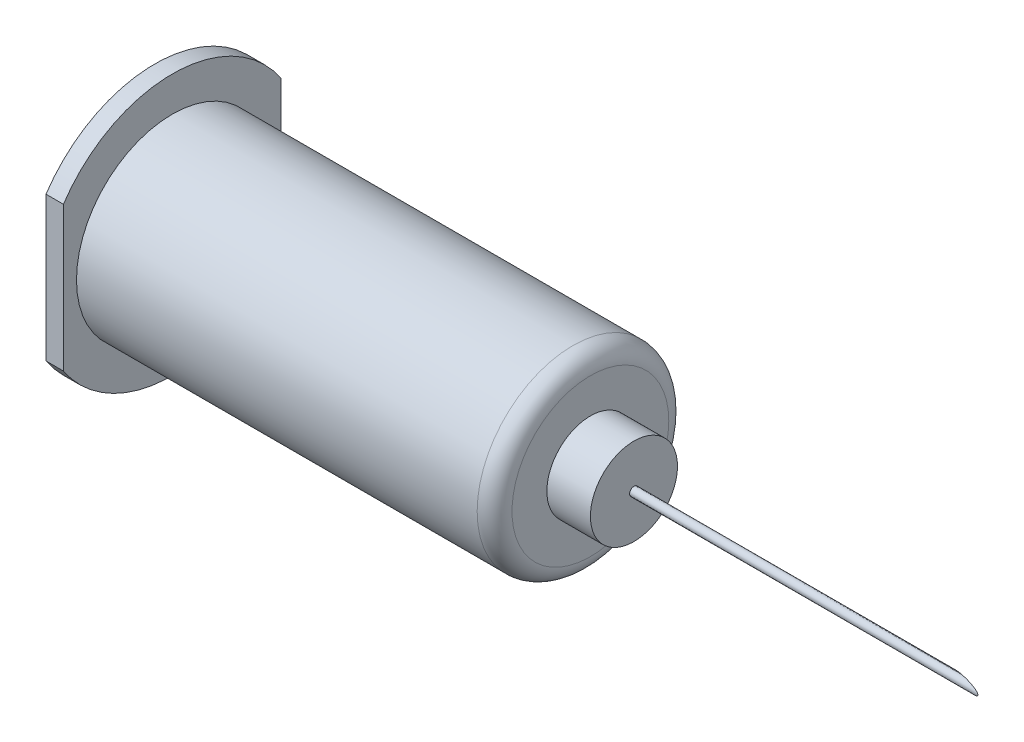
ISO-10303-21;
HEADER;
FILE_DESCRIPTION(('STEP AP214'),'2;1');
FILE_NAME('part.step','',(''),(''),'','','');
FILE_SCHEMA(('AUTOMOTIVE_DESIGN { 1 0 10303 214 1 1 1 1 }'));
ENDSEC;
DATA;
#1=APPLICATION_CONTEXT('core data for automotive mechanical design processes');
#2=APPLICATION_PROTOCOL_DEFINITION('international standard','automotive_design',2000,#1);
#3=PRODUCT_CONTEXT('',#1,'mechanical');
#4=PRODUCT('Part','Part','',(#3));
#5=PRODUCT_RELATED_PRODUCT_CATEGORY('part','',(#4));
#6=PRODUCT_DEFINITION_FORMATION('','',#4);
#7=PRODUCT_DEFINITION_CONTEXT('part definition',#1,'design');
#8=PRODUCT_DEFINITION('design','',#6,#7);
#9=PRODUCT_DEFINITION_SHAPE('','',#8);
#10=(LENGTH_UNIT() NAMED_UNIT(*) SI_UNIT(.MILLI.,.METRE.));
#11=(NAMED_UNIT(*) PLANE_ANGLE_UNIT() SI_UNIT($,.RADIAN.));
#12=(NAMED_UNIT(*) SI_UNIT($,.STERADIAN.) SOLID_ANGLE_UNIT());
#13=UNCERTAINTY_MEASURE_WITH_UNIT(LENGTH_MEASURE(1.E-05),#10,'distance_accuracy_value','');
#14=(GEOMETRIC_REPRESENTATION_CONTEXT(3) GLOBAL_UNCERTAINTY_ASSIGNED_CONTEXT((#13)) GLOBAL_UNIT_ASSIGNED_CONTEXT((#10,
#11,#12)) REPRESENTATION_CONTEXT('',''));
#15=CARTESIAN_POINT('',(0.,0.,0.));
#16=DIRECTION('',(0.,0.,1.));
#17=DIRECTION('',(1.,0.,0.));
#18=AXIS2_PLACEMENT_3D('',#15,#16,#17);
#19=CARTESIAN_POINT('',(2.,0.,0.));
#20=DIRECTION('',(1.,0.,0.));
#21=DIRECTION('',(0.,0.,-1.));
#22=AXIS2_PLACEMENT_3D('',#19,#20,#21);
#23=PLANE('',#22);
#24=CARTESIAN_POINT('',(2.,0.,0.));
#25=DIRECTION('',(1.,0.,0.));
#26=DIRECTION('',(0.,0.,-1.));
#27=AXIS2_PLACEMENT_3D('',#24,#25,#26);
#28=CIRCLE('',#27,15.);
#29=CARTESIAN_POINT('',(2.,-8.2915619758885,12.5));
#30=VERTEX_POINT('',#29);
#31=CARTESIAN_POINT('',(2.,-8.2915619758885,-12.5));
#32=VERTEX_POINT('',#31);
#33=EDGE_CURVE('E112',#30,#32,#28,.T.);
#34=ORIENTED_EDGE('',*,*,#33,.T.);
#35=DIRECTION('',(0.,1.,0.));
#36=VECTOR('',#35,1.);
#37=CARTESIAN_POINT('',(2.,-8.2915619758885,-12.5));
#38=LINE('',#37,#36);
#39=CARTESIAN_POINT('',(2.,8.2915619758885,-12.5));
#40=VERTEX_POINT('',#39);
#41=EDGE_CURVE('E107',#32,#40,#38,.T.);
#42=ORIENTED_EDGE('',*,*,#41,.T.);
#43=CARTESIAN_POINT('',(2.,0.,0.));
#44=DIRECTION('',(1.,0.,0.));
#45=DIRECTION('',(0.,0.,-1.));
#46=AXIS2_PLACEMENT_3D('',#43,#44,#45);
#47=CIRCLE('',#46,15.);
#48=CARTESIAN_POINT('',(2.,8.2915619758885,12.5));
#49=VERTEX_POINT('',#48);
#50=EDGE_CURVE('E110',#40,#49,#47,.T.);
#51=ORIENTED_EDGE('',*,*,#50,.T.);
#52=DIRECTION('',(0.,-1.,0.));
#53=VECTOR('',#52,1.);
#54=CARTESIAN_POINT('',(2.,-8.2915619758885,12.5));
#55=LINE('',#54,#53);
#56=EDGE_CURVE('E77',#49,#30,#55,.T.);
#57=ORIENTED_EDGE('',*,*,#56,.T.);
#58=EDGE_LOOP('',(#34,#42,#51,#57));
#59=FACE_BOUND('',#58,.T.);
#60=CARTESIAN_POINT('',(2.,0.,0.));
#61=DIRECTION('',(1.,0.,0.));
#62=DIRECTION('',(0.,0.,-1.));
#63=AXIS2_PLACEMENT_3D('',#60,#61,#62);
#64=CIRCLE('',#63,10.);
#65=CARTESIAN_POINT('',(2.,0.,-10.));
#66=VERTEX_POINT('',#65);
#67=EDGE_CURVE('E127',#66,#66,#64,.T.);
#68=ORIENTED_EDGE('',*,*,#67,.F.);
#69=EDGE_LOOP('',(#68));
#70=FACE_BOUND('',#69,.T.);
#71=ADVANCED_FACE('F60',(#59,#70),#23,.T.);
#72=CARTESIAN_POINT('',(0.,0.,0.));
#73=DIRECTION('',(1.,0.,0.));
#74=DIRECTION('',(0.,0.,-1.));
#75=AXIS2_PLACEMENT_3D('',#72,#73,#74);
#76=PLANE('',#75);
#77=CARTESIAN_POINT('',(0.,0.,0.));
#78=DIRECTION('',(1.,0.,0.));
#79=DIRECTION('',(0.,0.,-1.));
#80=AXIS2_PLACEMENT_3D('',#77,#78,#79);
#81=CIRCLE('',#80,15.);
#82=CARTESIAN_POINT('',(0.,-8.2915619758885,12.5));
#83=VERTEX_POINT('',#82);
#84=CARTESIAN_POINT('',(0.,-8.2915619758885,-12.5));
#85=VERTEX_POINT('',#84);
#86=EDGE_CURVE('E124',#83,#85,#81,.T.);
#87=ORIENTED_EDGE('',*,*,#86,.F.);
#88=DIRECTION('',(0.,-1.,0.));
#89=VECTOR('',#88,1.);
#90=CARTESIAN_POINT('',(0.,-8.2915619758885,12.5));
#91=LINE('',#90,#89);
#92=CARTESIAN_POINT('',(0.,8.2915619758885,12.5));
#93=VERTEX_POINT('',#92);
#94=EDGE_CURVE('E100',#93,#83,#91,.T.);
#95=ORIENTED_EDGE('',*,*,#94,.F.);
#96=CARTESIAN_POINT('',(0.,0.,0.));
#97=DIRECTION('',(1.,0.,0.));
#98=DIRECTION('',(0.,0.,-1.));
#99=AXIS2_PLACEMENT_3D('',#96,#97,#98);
#100=CIRCLE('',#99,15.);
#101=CARTESIAN_POINT('',(0.,8.2915619758885,-12.5));
#102=VERTEX_POINT('',#101);
#103=EDGE_CURVE('E94',#102,#93,#100,.T.);
#104=ORIENTED_EDGE('',*,*,#103,.F.);
#105=DIRECTION('',(0.,1.,0.));
#106=VECTOR('',#105,1.);
#107=CARTESIAN_POINT('',(0.,-8.2915619758885,-12.5));
#108=LINE('',#107,#106);
#109=EDGE_CURVE('E116',#85,#102,#108,.T.);
#110=ORIENTED_EDGE('',*,*,#109,.F.);
#111=EDGE_LOOP('',(#87,#95,#104,#110));
#112=FACE_BOUND('',#111,.T.);
#113=CARTESIAN_POINT('',(0.,0.,0.));
#114=DIRECTION('',(1.,0.,0.));
#115=DIRECTION('',(0.,0.,-1.));
#116=AXIS2_PLACEMENT_3D('',#113,#114,#115);
#117=CIRCLE('',#116,10.);
#118=CARTESIAN_POINT('',(0.,0.,-10.));
#119=VERTEX_POINT('',#118);
#120=EDGE_CURVE('E139',#119,#119,#117,.T.);
#121=ORIENTED_EDGE('',*,*,#120,.T.);
#122=EDGE_LOOP('',(#121));
#123=FACE_BOUND('',#122,.T.);
#124=ADVANCED_FACE('F135',(#112,#123),#76,.F.);
#125=CARTESIAN_POINT('',(2.,0.,0.));
#126=DIRECTION('',(-1.,0.,0.));
#127=DIRECTION('',(0.,0.,1.));
#128=AXIS2_PLACEMENT_3D('',#125,#126,#127);
#129=CYLINDRICAL_SURFACE('',#128,15.);
#130=ORIENTED_EDGE('',*,*,#86,.T.);
#131=DIRECTION('',(-1.,0.,0.));
#132=VECTOR('',#131,1.);
#133=CARTESIAN_POINT('',(2.,-8.2915619758885,-12.5));
#134=LINE('',#133,#132);
#135=EDGE_CURVE('E14',#32,#85,#134,.T.);
#136=ORIENTED_EDGE('',*,*,#135,.F.);
#137=ORIENTED_EDGE('',*,*,#33,.F.);
#138=DIRECTION('',(-1.,0.,0.));
#139=VECTOR('',#138,1.);
#140=CARTESIAN_POINT('',(2.,-8.2915619758885,12.5));
#141=LINE('',#140,#139);
#142=EDGE_CURVE('E120',#30,#83,#141,.T.);
#143=ORIENTED_EDGE('',*,*,#142,.T.);
#144=EDGE_LOOP('',(#130,#136,#137,#143));
#145=FACE_BOUND('',#144,.T.);
#146=ADVANCED_FACE('F62',(#145),#129,.T.);
#147=CARTESIAN_POINT('',(2.,-8.2915619758885,-12.5));
#148=DIRECTION('',(0.,0.,1.));
#149=DIRECTION('',(1.,0.,0.));
#150=AXIS2_PLACEMENT_3D('',#147,#148,#149);
#151=PLANE('',#150);
#152=ORIENTED_EDGE('',*,*,#109,.T.);
#153=DIRECTION('',(-1.,0.,0.));
#154=VECTOR('',#153,1.);
#155=CARTESIAN_POINT('',(2.,8.2915619758885,-12.5));
#156=LINE('',#155,#154);
#157=EDGE_CURVE('E69',#40,#102,#156,.T.);
#158=ORIENTED_EDGE('',*,*,#157,.F.);
#159=ORIENTED_EDGE('',*,*,#41,.F.);
#160=ORIENTED_EDGE('',*,*,#135,.T.);
#161=EDGE_LOOP('',(#152,#158,#159,#160));
#162=FACE_BOUND('',#161,.T.);
#163=ADVANCED_FACE('F115',(#162),#151,.F.);
#164=CARTESIAN_POINT('',(2.,0.,0.));
#165=DIRECTION('',(-1.,0.,0.));
#166=DIRECTION('',(0.,0.,1.));
#167=AXIS2_PLACEMENT_3D('',#164,#165,#166);
#168=CYLINDRICAL_SURFACE('',#167,15.);
#169=ORIENTED_EDGE('',*,*,#103,.T.);
#170=DIRECTION('',(-1.,0.,0.));
#171=VECTOR('',#170,1.);
#172=CARTESIAN_POINT('',(2.,8.2915619758885,12.5));
#173=LINE('',#172,#171);
#174=EDGE_CURVE('E117',#49,#93,#173,.T.);
#175=ORIENTED_EDGE('',*,*,#174,.F.);
#176=ORIENTED_EDGE('',*,*,#50,.F.);
#177=ORIENTED_EDGE('',*,*,#157,.T.);
#178=EDGE_LOOP('',(#169,#175,#176,#177));
#179=FACE_BOUND('',#178,.T.);
#180=ADVANCED_FACE('F118',(#179),#168,.T.);
#181=CARTESIAN_POINT('',(2.,-8.2915619758885,12.5));
#182=DIRECTION('',(0.,0.,-1.));
#183=DIRECTION('',(-1.,0.,0.));
#184=AXIS2_PLACEMENT_3D('',#181,#182,#183);
#185=PLANE('',#184);
#186=ORIENTED_EDGE('',*,*,#94,.T.);
#187=ORIENTED_EDGE('',*,*,#142,.F.);
#188=ORIENTED_EDGE('',*,*,#56,.F.);
#189=ORIENTED_EDGE('',*,*,#174,.T.);
#190=EDGE_LOOP('',(#186,#187,#188,#189));
#191=FACE_BOUND('',#190,.T.);
#192=ADVANCED_FACE('F132',(#191),#185,.F.);
#193=CARTESIAN_POINT('',(2.,0.,0.));
#194=DIRECTION('',(-1.,0.,0.));
#195=DIRECTION('',(0.,0.,1.));
#196=AXIS2_PLACEMENT_3D('',#193,#194,#195);
#197=CYLINDRICAL_SURFACE('',#196,10.);
#198=ORIENTED_EDGE('',*,*,#67,.T.);
#199=EDGE_LOOP('',(#198));
#200=FACE_BOUND('',#199,.T.);
#201=ORIENTED_EDGE('',*,*,#120,.F.);
#202=EDGE_LOOP('',(#201));
#203=FACE_BOUND('',#202,.T.);
#204=ADVANCED_FACE('F145',(#200,#203),#197,.F.);
#205=CLOSED_SHELL('',(#71,#124,#146,#163,#180,#192,#204));
#206=MANIFOLD_SOLID_BREP('B2',#205);
#207=CARTESIAN_POINT('',(50.,0.,0.));
#208=DIRECTION('',(-1.,0.,0.));
#209=DIRECTION('',(0.,0.,1.));
#210=AXIS2_PLACEMENT_3D('',#207,#208,#209);
#211=CYLINDRICAL_SURFACE('',#210,11.);
#212=CARTESIAN_POINT('',(48.,0.,0.));
#213=DIRECTION('',(1.,0.,0.));
#214=DIRECTION('',(0.,0.,-1.));
#215=AXIS2_PLACEMENT_3D('',#212,#213,#214);
#216=CIRCLE('',#215,11.);
#217=CARTESIAN_POINT('',(48.,0.,-11.));
#218=VERTEX_POINT('',#217);
#219=EDGE_CURVE('E218',#218,#218,#216,.F.);
#220=ORIENTED_EDGE('',*,*,#219,.T.);
#221=EDGE_LOOP('',(#220));
#222=FACE_BOUND('',#221,.T.);
#223=CARTESIAN_POINT('',(0.,0.,0.));
#224=DIRECTION('',(1.,0.,0.));
#225=DIRECTION('',(0.,0.,-1.));
#226=AXIS2_PLACEMENT_3D('',#223,#224,#225);
#227=CIRCLE('',#226,11.);
#228=CARTESIAN_POINT('',(0.,0.,-11.));
#229=VERTEX_POINT('',#228);
#230=EDGE_CURVE('E227',#229,#229,#227,.T.);
#231=ORIENTED_EDGE('',*,*,#230,.T.);
#232=EDGE_LOOP('',(#231));
#233=FACE_BOUND('',#232,.T.);
#234=ADVANCED_FACE('F210',(#222,#233),#211,.T.);
#235=CARTESIAN_POINT('',(50.,0.,0.));
#236=DIRECTION('',(1.,0.,0.));
#237=DIRECTION('',(0.,0.,-1.));
#238=AXIS2_PLACEMENT_3D('',#235,#236,#237);
#239=PLANE('',#238);
#240=CARTESIAN_POINT('',(50.,0.,0.));
#241=DIRECTION('',(1.,0.,0.));
#242=DIRECTION('',(0.,0.,-1.));
#243=AXIS2_PLACEMENT_3D('',#240,#241,#242);
#244=CIRCLE('',#243,5.);
#245=CARTESIAN_POINT('',(50.,0.,-5.));
#246=VERTEX_POINT('',#245);
#247=EDGE_CURVE('E231',#246,#246,#244,.T.);
#248=ORIENTED_EDGE('',*,*,#247,.F.);
#249=EDGE_LOOP('',(#248));
#250=FACE_BOUND('',#249,.T.);
#251=CARTESIAN_POINT('',(50.,0.,0.));
#252=DIRECTION('',(1.,0.,0.));
#253=DIRECTION('',(0.,0.,-1.));
#254=AXIS2_PLACEMENT_3D('',#251,#252,#253);
#255=CIRCLE('',#254,9.);
#256=CARTESIAN_POINT('',(50.,0.,-9.));
#257=VERTEX_POINT('',#256);
#258=EDGE_CURVE('E222',#257,#257,#255,.T.);
#259=ORIENTED_EDGE('',*,*,#258,.T.);
#260=EDGE_LOOP('',(#259));
#261=FACE_BOUND('',#260,.T.);
#262=ADVANCED_FACE('F279',(#250,#261),#239,.T.);
#263=CARTESIAN_POINT('',(0.,0.,0.));
#264=DIRECTION('',(1.,0.,0.));
#265=DIRECTION('',(0.,0.,-1.));
#266=AXIS2_PLACEMENT_3D('',#263,#264,#265);
#267=PLANE('',#266);
#268=CARTESIAN_POINT('',(0.,0.,0.));
#269=DIRECTION('',(1.,0.,0.));
#270=DIRECTION('',(0.,0.,-1.));
#271=AXIS2_PLACEMENT_3D('',#268,#269,#270);
#272=CIRCLE('',#271,10.);
#273=CARTESIAN_POINT('',(0.,0.,-10.));
#274=VERTEX_POINT('',#273);
#275=EDGE_CURVE('E240',#274,#274,#272,.T.);
#276=ORIENTED_EDGE('',*,*,#275,.T.);
#277=EDGE_LOOP('',(#276));
#278=FACE_BOUND('',#277,.T.);
#279=ORIENTED_EDGE('',*,*,#230,.F.);
#280=EDGE_LOOP('',(#279));
#281=FACE_BOUND('',#280,.T.);
#282=ADVANCED_FACE('F284',(#278,#281),#267,.F.);
#283=CARTESIAN_POINT('',(48.,0.,0.));
#284=DIRECTION('',(1.,0.,0.));
#285=DIRECTION('',(0.,0.,-1.));
#286=AXIS2_PLACEMENT_3D('',#283,#284,#285);
#287=TOROIDAL_SURFACE('',#286,9.,2.);
#288=ORIENTED_EDGE('',*,*,#219,.F.);
#289=EDGE_LOOP('',(#288));
#290=FACE_BOUND('',#289,.T.);
#291=ORIENTED_EDGE('',*,*,#258,.F.);
#292=EDGE_LOOP('',(#291));
#293=FACE_BOUND('',#292,.T.);
#294=ADVANCED_FACE('F212',(#290,#293),#287,.T.);
#295=CARTESIAN_POINT('',(55.,0.,0.));
#296=DIRECTION('',(-1.,0.,0.));
#297=DIRECTION('',(0.,0.,1.));
#298=AXIS2_PLACEMENT_3D('',#295,#296,#297);
#299=CYLINDRICAL_SURFACE('',#298,5.);
#300=CARTESIAN_POINT('',(55.,0.,0.));
#301=DIRECTION('',(1.,0.,0.));
#302=DIRECTION('',(0.,0.,-1.));
#303=AXIS2_PLACEMENT_3D('',#300,#301,#302);
#304=CIRCLE('',#303,5.);
#305=CARTESIAN_POINT('',(55.,0.,-5.));
#306=VERTEX_POINT('',#305);
#307=EDGE_CURVE('E230',#306,#306,#304,.T.);
#308=ORIENTED_EDGE('',*,*,#307,.F.);
#309=EDGE_LOOP('',(#308));
#310=FACE_BOUND('',#309,.T.);
#311=ORIENTED_EDGE('',*,*,#247,.T.);
#312=EDGE_LOOP('',(#311));
#313=FACE_BOUND('',#312,.T.);
#314=ADVANCED_FACE('F292',(#310,#313),#299,.T.);
#315=CARTESIAN_POINT('',(55.,0.,0.));
#316=DIRECTION('',(1.,0.,0.));
#317=DIRECTION('',(0.,0.,-1.));
#318=AXIS2_PLACEMENT_3D('',#315,#316,#317);
#319=PLANE('',#318);
#320=CARTESIAN_POINT('',(55.,0.,0.));
#321=DIRECTION('',(1.,0.,0.));
#322=DIRECTION('',(0.,0.,-1.));
#323=AXIS2_PLACEMENT_3D('',#320,#321,#322);
#324=CIRCLE('',#323,0.5);
#325=CARTESIAN_POINT('',(55.,0.,-0.5));
#326=VERTEX_POINT('',#325);
#327=EDGE_CURVE('E234',#326,#326,#324,.T.);
#328=ORIENTED_EDGE('',*,*,#327,.F.);
#329=EDGE_LOOP('',(#328));
#330=FACE_BOUND('',#329,.T.);
#331=ORIENTED_EDGE('',*,*,#307,.T.);
#332=EDGE_LOOP('',(#331));
#333=FACE_BOUND('',#332,.T.);
#334=ADVANCED_FACE('F295',(#330,#333),#319,.T.);
#335=CARTESIAN_POINT('',(95.,0.,0.));
#336=DIRECTION('',(-1.,0.,0.));
#337=DIRECTION('',(0.,0.,1.));
#338=AXIS2_PLACEMENT_3D('',#335,#336,#337);
#339=CYLINDRICAL_SURFACE('',#338,0.5);
#340=CARTESIAN_POINT('',(93.0112915817768,0.,0.));
#341=DIRECTION('',(-0.243831050268885,0.,0.969817724587859));
#342=DIRECTION('',(-0.969817724587859,0.,-0.243831050268885));
#343=AXIS2_PLACEMENT_3D('',#340,#341,#342);
#344=ELLIPSE('',#343,2.05060019816436,0.5);
#345=CARTESIAN_POINT('',(91.0225831635536,0.,-0.5));
#346=VERTEX_POINT('',#345);
#347=EDGE_CURVE('E257',#346,#346,#344,.T.);
#348=ORIENTED_EDGE('',*,*,#347,.T.);
#349=EDGE_LOOP('',(#348));
#350=FACE_BOUND('',#349,.T.);
#351=ORIENTED_EDGE('',*,*,#327,.T.);
#352=EDGE_LOOP('',(#351));
#353=FACE_BOUND('',#352,.T.);
#354=ADVANCED_FACE('F299',(#350,#353),#339,.T.);
#355=CARTESIAN_POINT('',(50.,0.,0.));
#356=DIRECTION('',(-1.,0.,0.));
#357=DIRECTION('',(0.,0.,1.));
#358=AXIS2_PLACEMENT_3D('',#355,#356,#357);
#359=CYLINDRICAL_SURFACE('',#358,10.);
#360=CARTESIAN_POINT('',(48.,0.,0.));
#361=DIRECTION('',(-1.,0.,0.));
#362=DIRECTION('',(0.,0.,1.));
#363=AXIS2_PLACEMENT_3D('',#360,#361,#362);
#364=CIRCLE('',#363,10.);
#365=CARTESIAN_POINT('',(48.,0.,10.));
#366=VERTEX_POINT('',#365);
#367=EDGE_CURVE('E239',#366,#366,#364,.T.);
#368=ORIENTED_EDGE('',*,*,#367,.F.);
#369=EDGE_LOOP('',(#368));
#370=FACE_BOUND('',#369,.T.);
#371=ORIENTED_EDGE('',*,*,#275,.F.);
#372=EDGE_LOOP('',(#371));
#373=FACE_BOUND('',#372,.T.);
#374=ADVANCED_FACE('F303',(#370,#373),#359,.F.);
#375=CARTESIAN_POINT('',(49.,0.,0.));
#376=DIRECTION('',(1.,0.,0.));
#377=DIRECTION('',(0.,0.,-1.));
#378=AXIS2_PLACEMENT_3D('',#375,#376,#377);
#379=PLANE('',#378);
#380=CARTESIAN_POINT('',(49.,0.,0.));
#381=DIRECTION('',(1.,0.,0.));
#382=DIRECTION('',(0.,0.,-1.));
#383=AXIS2_PLACEMENT_3D('',#380,#381,#382);
#384=CIRCLE('',#383,4.);
#385=CARTESIAN_POINT('',(49.,0.,-4.));
#386=VERTEX_POINT('',#385);
#387=EDGE_CURVE('E247',#386,#386,#384,.T.);
#388=ORIENTED_EDGE('',*,*,#387,.T.);
#389=EDGE_LOOP('',(#388));
#390=FACE_BOUND('',#389,.T.);
#391=CARTESIAN_POINT('',(49.,0.,0.));
#392=DIRECTION('',(1.,0.,0.));
#393=DIRECTION('',(0.,0.,-1.));
#394=AXIS2_PLACEMENT_3D('',#391,#392,#393);
#395=CIRCLE('',#394,9.);
#396=CARTESIAN_POINT('',(49.,0.,-9.));
#397=VERTEX_POINT('',#396);
#398=EDGE_CURVE('E243',#397,#397,#395,.T.);
#399=ORIENTED_EDGE('',*,*,#398,.F.);
#400=EDGE_LOOP('',(#399));
#401=FACE_BOUND('',#400,.T.);
#402=ADVANCED_FACE('F317',(#390,#401),#379,.F.);
#403=CARTESIAN_POINT('',(48.,0.,0.));
#404=DIRECTION('',(1.,0.,0.));
#405=DIRECTION('',(0.,0.,-1.));
#406=AXIS2_PLACEMENT_3D('',#403,#404,#405);
#407=TOROIDAL_SURFACE('',#406,9.,1.);
#408=ORIENTED_EDGE('',*,*,#367,.T.);
#409=EDGE_LOOP('',(#408));
#410=FACE_BOUND('',#409,.T.);
#411=ORIENTED_EDGE('',*,*,#398,.T.);
#412=EDGE_LOOP('',(#411));
#413=FACE_BOUND('',#412,.T.);
#414=ADVANCED_FACE('F313',(#410,#413),#407,.F.);
#415=CARTESIAN_POINT('',(55.,0.,0.));
#416=DIRECTION('',(-1.,0.,0.));
#417=DIRECTION('',(0.,0.,1.));
#418=AXIS2_PLACEMENT_3D('',#415,#416,#417);
#419=CYLINDRICAL_SURFACE('',#418,4.);
#420=CARTESIAN_POINT('',(54.,0.,0.));
#421=DIRECTION('',(1.,0.,0.));
#422=DIRECTION('',(0.,0.,-1.));
#423=AXIS2_PLACEMENT_3D('',#420,#421,#422);
#424=CIRCLE('',#423,4.);
#425=CARTESIAN_POINT('',(54.,0.,-4.));
#426=VERTEX_POINT('',#425);
#427=EDGE_CURVE('E244',#426,#426,#424,.T.);
#428=ORIENTED_EDGE('',*,*,#427,.T.);
#429=EDGE_LOOP('',(#428));
#430=FACE_BOUND('',#429,.T.);
#431=ORIENTED_EDGE('',*,*,#387,.F.);
#432=EDGE_LOOP('',(#431));
#433=FACE_BOUND('',#432,.T.);
#434=ADVANCED_FACE('F309',(#430,#433),#419,.F.);
#435=CARTESIAN_POINT('',(54.,0.,0.));
#436=DIRECTION('',(1.,0.,0.));
#437=DIRECTION('',(0.,0.,-1.));
#438=AXIS2_PLACEMENT_3D('',#435,#436,#437);
#439=PLANE('',#438);
#440=CARTESIAN_POINT('',(54.,0.,0.));
#441=DIRECTION('',(1.,0.,0.));
#442=DIRECTION('',(0.,0.,-1.));
#443=AXIS2_PLACEMENT_3D('',#440,#441,#442);
#444=CIRCLE('',#443,0.5);
#445=CARTESIAN_POINT('',(54.,0.,-0.5));
#446=VERTEX_POINT('',#445);
#447=EDGE_CURVE('E59',#446,#446,#444,.F.);
#448=ORIENTED_EDGE('',*,*,#447,.F.);
#449=EDGE_LOOP('',(#448));
#450=FACE_BOUND('',#449,.T.);
#451=ORIENTED_EDGE('',*,*,#427,.F.);
#452=EDGE_LOOP('',(#451));
#453=FACE_BOUND('',#452,.T.);
#454=ADVANCED_FACE('F305',(#450,#453),#439,.F.);
#455=CARTESIAN_POINT('',(29.,0.,0.));
#456=DIRECTION('',(1.,0.,0.));
#457=DIRECTION('',(0.,0.,-1.));
#458=AXIS2_PLACEMENT_3D('',#455,#456,#457);
#459=CYLINDRICAL_SURFACE('',#458,0.5);
#460=CARTESIAN_POINT('',(29.,0.,0.));
#461=DIRECTION('',(-1.,0.,0.));
#462=DIRECTION('',(0.,0.,1.));
#463=AXIS2_PLACEMENT_3D('',#460,#461,#462);
#464=CIRCLE('',#463,0.5);
#465=CARTESIAN_POINT('',(29.,0.,0.5));
#466=VERTEX_POINT('',#465);
#467=EDGE_CURVE('E250',#466,#466,#464,.T.);
#468=ORIENTED_EDGE('',*,*,#467,.F.);
#469=EDGE_LOOP('',(#468));
#470=FACE_BOUND('',#469,.T.);
#471=ORIENTED_EDGE('',*,*,#447,.T.);
#472=EDGE_LOOP('',(#471));
#473=FACE_BOUND('',#472,.T.);
#474=ADVANCED_FACE('F308',(#470,#473),#459,.T.);
#475=CARTESIAN_POINT('',(29.,0.,0.));
#476=DIRECTION('',(-1.,0.,0.));
#477=DIRECTION('',(0.,0.,1.));
#478=AXIS2_PLACEMENT_3D('',#475,#476,#477);
#479=PLANE('',#478);
#480=CARTESIAN_POINT('',(29.,0.,0.));
#481=DIRECTION('',(-1.,0.,0.));
#482=DIRECTION('',(0.,0.,1.));
#483=AXIS2_PLACEMENT_3D('',#480,#481,#482);
#484=CIRCLE('',#483,0.4);
#485=CARTESIAN_POINT('',(29.,0.,0.4));
#486=VERTEX_POINT('',#485);
#487=EDGE_CURVE('E260',#486,#486,#484,.T.);
#488=ORIENTED_EDGE('',*,*,#487,.F.);
#489=EDGE_LOOP('',(#488));
#490=FACE_BOUND('',#489,.T.);
#491=ORIENTED_EDGE('',*,*,#467,.T.);
#492=EDGE_LOOP('',(#491));
#493=FACE_BOUND('',#492,.T.);
#494=ADVANCED_FACE('F276',(#490,#493),#479,.T.);
#495=CARTESIAN_POINT('',(95.,-12.5,0.5));
#496=DIRECTION('',(-0.243831050268885,0.,0.969817724587859));
#497=DIRECTION('',(0.969817724587859,0.,0.243831050268885));
#498=AXIS2_PLACEMENT_3D('',#495,#496,#497);
#499=PLANE('',#498);
#500=CARTESIAN_POINT('',(93.0112915817768,0.,0.));
#501=DIRECTION('',(-0.243831050268885,0.,0.969817724587859));
#502=DIRECTION('',(-0.969817724587859,0.,-0.243831050268885));
#503=AXIS2_PLACEMENT_3D('',#500,#501,#502);
#504=ELLIPSE('',#503,1.64048015853149,0.4);
#505=CARTESIAN_POINT('',(91.4203248471983,0.,-0.4));
#506=VERTEX_POINT('',#505);
#507=EDGE_CURVE('E214',#506,#506,#504,.T.);
#508=ORIENTED_EDGE('',*,*,#507,.T.);
#509=EDGE_LOOP('',(#508));
#510=FACE_BOUND('',#509,.T.);
#511=ORIENTED_EDGE('',*,*,#347,.F.);
#512=EDGE_LOOP('',(#511));
#513=FACE_BOUND('',#512,.T.);
#514=ADVANCED_FACE('F267',(#510,#513),#499,.F.);
#515=CARTESIAN_POINT('',(101.,0.,0.));
#516=DIRECTION('',(-1.,0.,0.));
#517=DIRECTION('',(0.,0.,1.));
#518=AXIS2_PLACEMENT_3D('',#515,#516,#517);
#519=CYLINDRICAL_SURFACE('',#518,0.4);
#520=ORIENTED_EDGE('',*,*,#487,.T.);
#521=EDGE_LOOP('',(#520));
#522=FACE_BOUND('',#521,.T.);
#523=ORIENTED_EDGE('',*,*,#507,.F.);
#524=EDGE_LOOP('',(#523));
#525=FACE_BOUND('',#524,.T.);
#526=ADVANCED_FACE('F270',(#522,#525),#519,.F.);
#527=CLOSED_SHELL('',(#234,#262,#282,#294,#314,#334,#354,#374,#402,#414,#434,#454,#474,#494,
#514,#526));
#528=MANIFOLD_SOLID_BREP('B8',#527);
#529=ADVANCED_BREP_SHAPE_REPRESENTATION('',(#18,#206,#528),#14);
#530=SHAPE_DEFINITION_REPRESENTATION(#9,#529);
ENDSEC;
END-ISO-10303-21;
